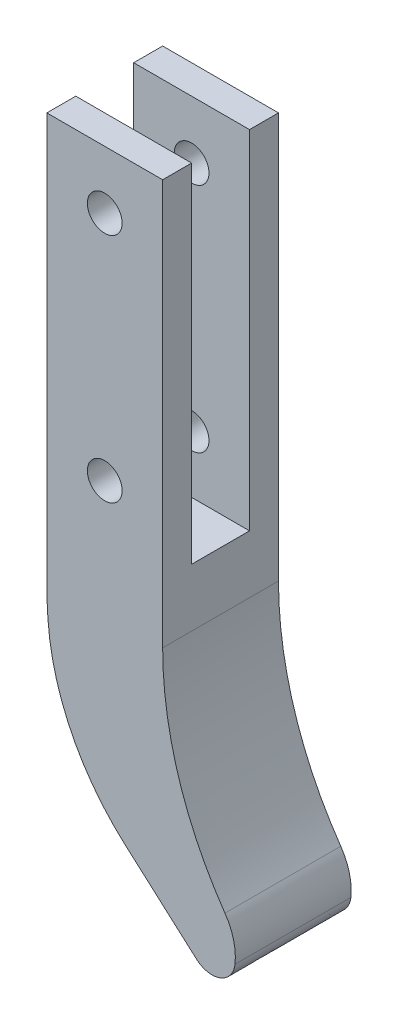
ISO-10303-21;
HEADER;
FILE_DESCRIPTION(('STEP AP214'),'2;1');
FILE_NAME('part.step','',(''),(''),'','','');
FILE_SCHEMA(('AUTOMOTIVE_DESIGN { 1 0 10303 214 1 1 1 1 }'));
ENDSEC;
DATA;
#1=APPLICATION_CONTEXT('core data for automotive mechanical design processes');
#2=APPLICATION_PROTOCOL_DEFINITION('international standard','automotive_design',2000,#1);
#3=PRODUCT_CONTEXT('',#1,'mechanical');
#4=PRODUCT('Part','Part','',(#3));
#5=PRODUCT_RELATED_PRODUCT_CATEGORY('part','',(#4));
#6=PRODUCT_DEFINITION_FORMATION('','',#4);
#7=PRODUCT_DEFINITION_CONTEXT('part definition',#1,'design');
#8=PRODUCT_DEFINITION('design','',#6,#7);
#9=PRODUCT_DEFINITION_SHAPE('','',#8);
#10=(LENGTH_UNIT() NAMED_UNIT(*) SI_UNIT(.MILLI.,.METRE.));
#11=(NAMED_UNIT(*) PLANE_ANGLE_UNIT() SI_UNIT($,.RADIAN.));
#12=(NAMED_UNIT(*) SI_UNIT($,.STERADIAN.) SOLID_ANGLE_UNIT());
#13=UNCERTAINTY_MEASURE_WITH_UNIT(LENGTH_MEASURE(1.E-05),#10,'distance_accuracy_value','');
#14=(GEOMETRIC_REPRESENTATION_CONTEXT(3) GLOBAL_UNCERTAINTY_ASSIGNED_CONTEXT((#13)) GLOBAL_UNIT_ASSIGNED_CONTEXT((#10,
#11,#12)) REPRESENTATION_CONTEXT('',''));
#15=CARTESIAN_POINT('',(0.,0.,0.));
#16=DIRECTION('',(0.,0.,1.));
#17=DIRECTION('',(1.,0.,0.));
#18=AXIS2_PLACEMENT_3D('',#15,#16,#17);
#19=CARTESIAN_POINT('',(20.0488604862741,-36.3971514248094,10.));
#20=DIRECTION('',(0.,0.,-1.));
#21=DIRECTION('',(-1.,0.,0.));
#22=AXIS2_PLACEMENT_3D('',#19,#20,#21);
#23=CYLINDRICAL_SURFACE('',#22,20.);
#24=DIRECTION('',(0.,0.,1.));
#25=VECTOR('',#24,1.);
#26=CARTESIAN_POINT('',(6.78118868781741,-51.3627414582306,10.));
#27=LINE('',#26,#25);
#28=CARTESIAN_POINT('',(6.78118868781742,-51.3627414582306,10.));
#29=VERTEX_POINT('',#28);
#30=CARTESIAN_POINT('',(6.78118868781742,-51.3627414582306,0.));
#31=VERTEX_POINT('',#30);
#32=EDGE_CURVE('E353',#29,#31,#27,.F.);
#33=ORIENTED_EDGE('',*,*,#32,.F.);
#34=CARTESIAN_POINT('',(20.0488604862741,-36.3971514248094,10.));
#35=DIRECTION('',(0.,0.,1.));
#36=DIRECTION('',(1.,0.,0.));
#37=AXIS2_PLACEMENT_3D('',#34,#35,#36);
#38=CIRCLE('',#37,20.);
#39=CARTESIAN_POINT('',(0.0977209725483014,-37.7943028496189,10.));
#40=VERTEX_POINT('',#39);
#41=EDGE_CURVE('E51',#40,#29,#38,.T.);
#42=ORIENTED_EDGE('',*,*,#41,.F.);
#43=DIRECTION('',(0.,0.,-1.));
#44=VECTOR('',#43,1.);
#45=CARTESIAN_POINT('',(0.0977209725482875,-37.7943028496189,10.));
#46=LINE('',#45,#44);
#47=CARTESIAN_POINT('',(0.0977209725483014,-37.7943028496189,0.));
#48=VERTEX_POINT('',#47);
#49=EDGE_CURVE('E351',#48,#40,#46,.F.);
#50=ORIENTED_EDGE('',*,*,#49,.F.);
#51=CARTESIAN_POINT('',(20.0488604862741,-36.3971514248094,0.));
#52=DIRECTION('',(0.,0.,1.));
#53=DIRECTION('',(1.,0.,0.));
#54=AXIS2_PLACEMENT_3D('',#51,#52,#53);
#55=CIRCLE('',#54,20.);
#56=EDGE_CURVE('E11',#31,#48,#55,.F.);
#57=ORIENTED_EDGE('',*,*,#56,.F.);
#58=EDGE_LOOP('',(#33,#42,#50,#57));
#59=FACE_BOUND('',#58,.T.);
#60=ADVANCED_FACE('F43',(#59),#23,.T.);
#61=CARTESIAN_POINT('',(40.,-35.,10.));
#62=DIRECTION('',(0.,0.,-1.));
#63=DIRECTION('',(-1.,0.,0.));
#64=AXIS2_PLACEMENT_3D('',#61,#62,#63);
#65=CYLINDRICAL_SURFACE('',#64,40.);
#66=CARTESIAN_POINT('',(40.,-35.,0.));
#67=DIRECTION('',(0.,0.,1.));
#68=DIRECTION('',(1.,0.,0.));
#69=AXIS2_PLACEMENT_3D('',#66,#67,#68);
#70=CIRCLE('',#69,40.);
#71=CARTESIAN_POINT('',(0.,-35.,0.));
#72=VERTEX_POINT('',#71);
#73=EDGE_CURVE('E182',#72,#48,#70,.T.);
#74=ORIENTED_EDGE('',*,*,#73,.T.);
#75=ORIENTED_EDGE('',*,*,#49,.T.);
#76=CARTESIAN_POINT('',(40.,-35.,10.));
#77=DIRECTION('',(0.,0.,1.));
#78=DIRECTION('',(1.,0.,0.));
#79=AXIS2_PLACEMENT_3D('',#76,#77,#78);
#80=CIRCLE('',#79,40.);
#81=CARTESIAN_POINT('',(0.,-35.,10.));
#82=VERTEX_POINT('',#81);
#83=EDGE_CURVE('E189',#82,#40,#80,.T.);
#84=ORIENTED_EDGE('',*,*,#83,.F.);
#85=DIRECTION('',(0.,0.,-1.));
#86=VECTOR('',#85,1.);
#87=CARTESIAN_POINT('',(0.,-35.,10.));
#88=LINE('',#87,#86);
#89=EDGE_CURVE('E350',#82,#72,#88,.T.);
#90=ORIENTED_EDGE('',*,*,#89,.T.);
#91=EDGE_LOOP('',(#74,#75,#84,#90));
#92=FACE_BOUND('',#91,.T.);
#93=ADVANCED_FACE('F275',(#92),#65,.T.);
#94=CARTESIAN_POINT('',(11.2771867673099,-55.,10.));
#95=DIRECTION('',(0.,0.,-1.));
#96=DIRECTION('',(-1.,0.,0.));
#97=AXIS2_PLACEMENT_3D('',#94,#95,#96);
#98=CYLINDRICAL_SURFACE('',#97,5.);
#99=CARTESIAN_POINT('',(11.2771867673099,-55.,10.));
#100=DIRECTION('',(0.,0.,1.));
#101=DIRECTION('',(1.,0.,0.));
#102=AXIS2_PLACEMENT_3D('',#99,#100,#101);
#103=CIRCLE('',#102,5.);
#104=CARTESIAN_POINT('',(16.2486101930785,-55.5338062585981,10.));
#105=VERTEX_POINT('',#104);
#106=CARTESIAN_POINT('',(15.3804458005513,-52.1428571428571,10.));
#107=VERTEX_POINT('',#106);
#108=EDGE_CURVE('E193',#105,#107,#103,.T.);
#109=ORIENTED_EDGE('',*,*,#108,.F.);
#110=CARTESIAN_POINT('',(16.2486101930785,-55.5338062585982,-0.5));
#111=CARTESIAN_POINT('',(16.2486101930785,-55.5338062585982,3.16666666666667));
#112=CARTESIAN_POINT('',(16.2486101930785,-55.5338062585982,6.83333333333333));
#113=CARTESIAN_POINT('',(16.2486101930785,-55.5338062585982,10.5));
#114=(BOUNDED_CURVE() B_SPLINE_CURVE(3,(#110,#111,#112,#113),.UNSPECIFIED.,.F.,
.F.) B_SPLINE_CURVE_WITH_KNOTS((4,4),(-0.0005,0.0105),
.UNSPECIFIED.) CURVE() GEOMETRIC_REPRESENTATION_ITEM() RATIONAL_B_SPLINE_CURVE((1.,1.,1.,1.)) REPRESENTATION_ITEM(''));
#115=CARTESIAN_POINT('',(16.2486101930785,-55.5338062585982,0.));
#116=VERTEX_POINT('',#115);
#117=EDGE_CURVE('E299',#105,#116,#114,.F.);
#118=ORIENTED_EDGE('',*,*,#117,.T.);
#119=CARTESIAN_POINT('',(11.2771867673099,-55.,0.));
#120=DIRECTION('',(0.,0.,1.));
#121=DIRECTION('',(1.,0.,0.));
#122=AXIS2_PLACEMENT_3D('',#119,#120,#121);
#123=CIRCLE('',#122,5.);
#124=CARTESIAN_POINT('',(15.3804458005513,-52.1428571428571,0.));
#125=VERTEX_POINT('',#124);
#126=EDGE_CURVE('E216',#116,#125,#123,.T.);
#127=ORIENTED_EDGE('',*,*,#126,.T.);
#128=DIRECTION('',(0.,0.,-1.));
#129=VECTOR('',#128,1.);
#130=CARTESIAN_POINT('',(15.3804458005513,-52.1428571428571,10.));
#131=LINE('',#130,#129);
#132=EDGE_CURVE('E368',#107,#125,#131,.T.);
#133=ORIENTED_EDGE('',*,*,#132,.F.);
#134=EDGE_LOOP('',(#109,#118,#127,#133));
#135=FACE_BOUND('',#134,.T.);
#136=ADVANCED_FACE('F230',(#135),#98,.T.);
#137=CARTESIAN_POINT('',(0.,0.,10.));
#138=DIRECTION('',(0.,0.,1.));
#139=DIRECTION('',(1.,0.,0.));
#140=AXIS2_PLACEMENT_3D('',#137,#138,#139);
#141=PLANE('',#140);
#142=CARTESIAN_POINT('',(5.,-25.,10.));
#143=DIRECTION('',(0.,0.,1.));
#144=DIRECTION('',(1.,0.,0.));
#145=AXIS2_PLACEMENT_3D('',#142,#143,#144);
#146=CIRCLE('',#145,1.5);
#147=CARTESIAN_POINT('',(6.5,-25.,10.));
#148=VERTEX_POINT('',#147);
#149=EDGE_CURVE('E312',#148,#148,#146,.T.);
#150=ORIENTED_EDGE('',*,*,#149,.F.);
#151=EDGE_LOOP('',(#150));
#152=FACE_BOUND('',#151,.T.);
#153=CARTESIAN_POINT('',(5.,-5.,10.));
#154=DIRECTION('',(0.,0.,1.));
#155=DIRECTION('',(1.,0.,0.));
#156=AXIS2_PLACEMENT_3D('',#153,#154,#155);
#157=CIRCLE('',#156,1.5);
#158=CARTESIAN_POINT('',(6.5,-5.,10.));
#159=VERTEX_POINT('',#158);
#160=EDGE_CURVE('E331',#159,#159,#157,.T.);
#161=ORIENTED_EDGE('',*,*,#160,.F.);
#162=EDGE_LOOP('',(#161));
#163=FACE_BOUND('',#162,.T.);
#164=ORIENTED_EDGE('',*,*,#83,.T.);
#165=ORIENTED_EDGE('',*,*,#41,.T.);
#166=DIRECTION('',(0.74827950167106,-0.663383589922837,0.));
#167=VECTOR('',#166,1.);
#168=CARTESIAN_POINT('',(-22.5120264657496,-25.392982583962,10.));
#169=LINE('',#168,#167);
#170=CARTESIAN_POINT('',(12.9332736429254,-56.816842758501,10.));
#171=VERTEX_POINT('',#170);
#172=EDGE_CURVE('E313',#29,#171,#169,.T.);
#173=ORIENTED_EDGE('',*,*,#172,.T.);
#174=CARTESIAN_POINT('',(16.2486101930785,-55.5338062585982,9.99999999999999));
#175=CARTESIAN_POINT('',(15.8346539242544,-59.3890474794122,9.99999999999999));
#176=CARTESIAN_POINT('',(12.9332736429254,-56.816842758501,9.99999999999999));
#177=(BOUNDED_CURVE() B_SPLINE_CURVE(2,(#174,#175,#176),.UNSPECIFIED.,.F.,
.F.) B_SPLINE_CURVE_WITH_KNOTS((3,3),(0.,1.),
.UNSPECIFIED.) CURVE() GEOMETRIC_REPRESENTATION_ITEM() RATIONAL_B_SPLINE_CURVE((1.,
0.45841853823333,1.)) REPRESENTATION_ITEM(''));
#178=EDGE_CURVE('E210',#171,#105,#177,.F.);
#179=ORIENTED_EDGE('',*,*,#178,.T.);
#180=ORIENTED_EDGE('',*,*,#108,.T.);
#181=CARTESIAN_POINT('',(40.,-35.,10.));
#182=DIRECTION('',(0.,0.,1.));
#183=DIRECTION('',(1.,0.,0.));
#184=AXIS2_PLACEMENT_3D('',#181,#182,#183);
#185=CIRCLE('',#184,30.);
#186=CARTESIAN_POINT('',(10.,-35.,10.));
#187=VERTEX_POINT('',#186);
#188=EDGE_CURVE('E197',#187,#107,#185,.T.);
#189=ORIENTED_EDGE('',*,*,#188,.F.);
#190=DIRECTION('',(0.,-1.,0.));
#191=VECTOR('',#190,1.);
#192=CARTESIAN_POINT('',(10.,0.,10.));
#193=LINE('',#192,#191);
#194=CARTESIAN_POINT('',(10.,0.,10.));
#195=VERTEX_POINT('',#194);
#196=EDGE_CURVE('E437',#195,#187,#193,.T.);
#197=ORIENTED_EDGE('',*,*,#196,.F.);
#198=DIRECTION('',(1.,0.,0.));
#199=VECTOR('',#198,1.);
#200=CARTESIAN_POINT('',(0.,0.,10.));
#201=LINE('',#200,#199);
#202=CARTESIAN_POINT('',(0.,0.,10.));
#203=VERTEX_POINT('',#202);
#204=EDGE_CURVE('E434',#203,#195,#201,.T.);
#205=ORIENTED_EDGE('',*,*,#204,.F.);
#206=DIRECTION('',(0.,-1.,0.));
#207=VECTOR('',#206,1.);
#208=CARTESIAN_POINT('',(0.,0.,10.));
#209=LINE('',#208,#207);
#210=EDGE_CURVE('E345',#203,#82,#209,.T.);
#211=ORIENTED_EDGE('',*,*,#210,.T.);
#212=EDGE_LOOP('',(#164,#165,#173,#179,#180,#189,#197,#205,#211));
#213=FACE_BOUND('',#212,.T.);
#214=ADVANCED_FACE('F219',(#152,#163,#213),#141,.T.);
#215=CARTESIAN_POINT('',(0.,0.,0.));
#216=DIRECTION('',(0.,0.,1.));
#217=DIRECTION('',(1.,0.,0.));
#218=AXIS2_PLACEMENT_3D('',#215,#216,#217);
#219=PLANE('',#218);
#220=CARTESIAN_POINT('',(5.,-5.,0.));
#221=DIRECTION('',(0.,0.,1.));
#222=DIRECTION('',(1.,0.,0.));
#223=AXIS2_PLACEMENT_3D('',#220,#221,#222);
#224=CIRCLE('',#223,1.5);
#225=CARTESIAN_POINT('',(6.5,-5.,0.));
#226=VERTEX_POINT('',#225);
#227=EDGE_CURVE('E332',#226,#226,#224,.T.);
#228=ORIENTED_EDGE('',*,*,#227,.T.);
#229=EDGE_LOOP('',(#228));
#230=FACE_BOUND('',#229,.T.);
#231=CARTESIAN_POINT('',(5.,-25.,0.));
#232=DIRECTION('',(0.,0.,1.));
#233=DIRECTION('',(1.,0.,0.));
#234=AXIS2_PLACEMENT_3D('',#231,#232,#233);
#235=CIRCLE('',#234,1.5);
#236=CARTESIAN_POINT('',(6.5,-25.,0.));
#237=VERTEX_POINT('',#236);
#238=EDGE_CURVE('E319',#237,#237,#235,.T.);
#239=ORIENTED_EDGE('',*,*,#238,.T.);
#240=EDGE_LOOP('',(#239));
#241=FACE_BOUND('',#240,.T.);
#242=DIRECTION('',(0.74827950167106,-0.663383589922837,0.));
#243=VECTOR('',#242,1.);
#244=CARTESIAN_POINT('',(-22.5120264657496,-25.392982583962,0.));
#245=LINE('',#244,#243);
#246=CARTESIAN_POINT('',(12.9332736429254,-56.816842758501,0.));
#247=VERTEX_POINT('',#246);
#248=EDGE_CURVE('E303',#31,#247,#245,.T.);
#249=ORIENTED_EDGE('',*,*,#248,.F.);
#250=ORIENTED_EDGE('',*,*,#56,.T.);
#251=ORIENTED_EDGE('',*,*,#73,.F.);
#252=DIRECTION('',(0.,-1.,0.));
#253=VECTOR('',#252,1.);
#254=CARTESIAN_POINT('',(0.,0.,0.));
#255=LINE('',#254,#253);
#256=CARTESIAN_POINT('',(0.,0.,0.));
#257=VERTEX_POINT('',#256);
#258=EDGE_CURVE('E194',#257,#72,#255,.T.);
#259=ORIENTED_EDGE('',*,*,#258,.F.);
#260=DIRECTION('',(1.,0.,0.));
#261=VECTOR('',#260,1.);
#262=CARTESIAN_POINT('',(0.,0.,0.));
#263=LINE('',#262,#261);
#264=CARTESIAN_POINT('',(10.,0.,0.));
#265=VERTEX_POINT('',#264);
#266=EDGE_CURVE('E421',#257,#265,#263,.T.);
#267=ORIENTED_EDGE('',*,*,#266,.T.);
#268=DIRECTION('',(0.,-1.,0.));
#269=VECTOR('',#268,1.);
#270=CARTESIAN_POINT('',(10.,0.,0.));
#271=LINE('',#270,#269);
#272=CARTESIAN_POINT('',(10.,-35.,0.));
#273=VERTEX_POINT('',#272);
#274=EDGE_CURVE('E409',#265,#273,#271,.T.);
#275=ORIENTED_EDGE('',*,*,#274,.T.);
#276=CARTESIAN_POINT('',(40.,-35.,0.));
#277=DIRECTION('',(0.,0.,1.));
#278=DIRECTION('',(1.,0.,0.));
#279=AXIS2_PLACEMENT_3D('',#276,#277,#278);
#280=CIRCLE('',#279,30.);
#281=EDGE_CURVE('E426',#273,#125,#280,.T.);
#282=ORIENTED_EDGE('',*,*,#281,.T.);
#283=ORIENTED_EDGE('',*,*,#126,.F.);
#284=CARTESIAN_POINT('',(12.9332736429254,-56.816842758501,0.));
#285=CARTESIAN_POINT('',(15.8346539242544,-59.3890474794122,0.));
#286=CARTESIAN_POINT('',(16.2486101930785,-55.5338062585981,0.));
#287=(BOUNDED_CURVE() B_SPLINE_CURVE(2,(#284,#285,#286),.UNSPECIFIED.,.F.,
.F.) B_SPLINE_CURVE_WITH_KNOTS((3,3),(0.,1.),
.UNSPECIFIED.) CURVE() GEOMETRIC_REPRESENTATION_ITEM() RATIONAL_B_SPLINE_CURVE((1.,
0.45841853823333,1.)) REPRESENTATION_ITEM(''));
#288=EDGE_CURVE('E358',#116,#247,#287,.F.);
#289=ORIENTED_EDGE('',*,*,#288,.T.);
#290=EDGE_LOOP('',(#249,#250,#251,#259,#267,#275,#282,#283,#289));
#291=FACE_BOUND('',#290,.T.);
#292=ADVANCED_FACE('F229',(#230,#241,#291),#219,.F.);
#293=CARTESIAN_POINT('',(0.,0.,10.));
#294=DIRECTION('',(0.,1.,0.));
#295=DIRECTION('',(0.,0.,1.));
#296=AXIS2_PLACEMENT_3D('',#293,#294,#295);
#297=PLANE('',#296);
#298=DIRECTION('',(0.,0.,-1.));
#299=VECTOR('',#298,1.);
#300=CARTESIAN_POINT('',(0.,0.,10.));
#301=LINE('',#300,#299);
#302=CARTESIAN_POINT('',(0.,0.,2.5));
#303=VERTEX_POINT('',#302);
#304=EDGE_CURVE('E406',#303,#257,#301,.T.);
#305=ORIENTED_EDGE('',*,*,#304,.F.);
#306=DIRECTION('',(1.,0.,0.));
#307=VECTOR('',#306,1.);
#308=CARTESIAN_POINT('',(0.,0.,2.5));
#309=LINE('',#308,#307);
#310=CARTESIAN_POINT('',(10.,0.,2.5));
#311=VERTEX_POINT('',#310);
#312=EDGE_CURVE('E183',#303,#311,#309,.T.);
#313=ORIENTED_EDGE('',*,*,#312,.T.);
#314=DIRECTION('',(0.,0.,-1.));
#315=VECTOR('',#314,1.);
#316=CARTESIAN_POINT('',(10.,0.,10.));
#317=LINE('',#316,#315);
#318=EDGE_CURVE('E404',#311,#265,#317,.T.);
#319=ORIENTED_EDGE('',*,*,#318,.T.);
#320=ORIENTED_EDGE('',*,*,#266,.F.);
#321=EDGE_LOOP('',(#305,#313,#319,#320));
#322=FACE_BOUND('',#321,.T.);
#323=ADVANCED_FACE('F236',(#322),#297,.T.);
#324=CARTESIAN_POINT('',(40.,-35.,10.));
#325=DIRECTION('',(0.,0.,-1.));
#326=DIRECTION('',(-1.,0.,0.));
#327=AXIS2_PLACEMENT_3D('',#324,#325,#326);
#328=CYLINDRICAL_SURFACE('',#327,30.);
#329=ORIENTED_EDGE('',*,*,#281,.F.);
#330=DIRECTION('',(0.,0.,-1.));
#331=VECTOR('',#330,1.);
#332=CARTESIAN_POINT('',(10.,-35.,10.));
#333=LINE('',#332,#331);
#334=EDGE_CURVE('E371',#187,#273,#333,.T.);
#335=ORIENTED_EDGE('',*,*,#334,.F.);
#336=ORIENTED_EDGE('',*,*,#188,.T.);
#337=ORIENTED_EDGE('',*,*,#132,.T.);
#338=EDGE_LOOP('',(#329,#335,#336,#337));
#339=FACE_BOUND('',#338,.T.);
#340=ADVANCED_FACE('F443',(#339),#328,.F.);
#341=CARTESIAN_POINT('',(10.,0.,10.));
#342=DIRECTION('',(1.,0.,0.));
#343=DIRECTION('',(0.,1.,0.));
#344=AXIS2_PLACEMENT_3D('',#341,#342,#343);
#345=PLANE('',#344);
#346=DIRECTION('',(0.,-1.,0.));
#347=VECTOR('',#346,1.);
#348=CARTESIAN_POINT('',(10.,0.,7.5));
#349=LINE('',#348,#347);
#350=CARTESIAN_POINT('',(10.,0.,7.5));
#351=VERTEX_POINT('',#350);
#352=CARTESIAN_POINT('',(10.,-30.,7.5));
#353=VERTEX_POINT('',#352);
#354=EDGE_CURVE('E142',#351,#353,#349,.T.);
#355=ORIENTED_EDGE('',*,*,#354,.F.);
#356=EDGE_CURVE('E379',#195,#351,#317,.T.);
#357=ORIENTED_EDGE('',*,*,#356,.F.);
#358=ORIENTED_EDGE('',*,*,#196,.T.);
#359=ORIENTED_EDGE('',*,*,#334,.T.);
#360=ORIENTED_EDGE('',*,*,#274,.F.);
#361=ORIENTED_EDGE('',*,*,#318,.F.);
#362=DIRECTION('',(0.,-1.,0.));
#363=VECTOR('',#362,1.);
#364=CARTESIAN_POINT('',(10.,0.,2.5));
#365=LINE('',#364,#363);
#366=CARTESIAN_POINT('',(10.,-30.,2.5));
#367=VERTEX_POINT('',#366);
#368=EDGE_CURVE('E163',#311,#367,#365,.T.);
#369=ORIENTED_EDGE('',*,*,#368,.T.);
#370=DIRECTION('',(0.,0.,-1.));
#371=VECTOR('',#370,1.);
#372=CARTESIAN_POINT('',(10.,-30.,0.));
#373=LINE('',#372,#371);
#374=EDGE_CURVE('E167',#353,#367,#373,.T.);
#375=ORIENTED_EDGE('',*,*,#374,.F.);
#376=EDGE_LOOP('',(#355,#357,#358,#359,#360,#361,#369,#375));
#377=FACE_BOUND('',#376,.T.);
#378=ADVANCED_FACE('F407',(#377),#345,.T.);
#379=DIRECTION('',(1.,0.,0.));
#380=VECTOR('',#379,1.);
#381=CARTESIAN_POINT('',(0.,0.,7.5));
#382=LINE('',#381,#380);
#383=CARTESIAN_POINT('',(0.,0.,7.5));
#384=VERTEX_POINT('',#383);
#385=EDGE_CURVE('E179',#384,#351,#382,.T.);
#386=ORIENTED_EDGE('',*,*,#385,.F.);
#387=EDGE_CURVE('E161',#203,#384,#301,.T.);
#388=ORIENTED_EDGE('',*,*,#387,.F.);
#389=ORIENTED_EDGE('',*,*,#204,.T.);
#390=ORIENTED_EDGE('',*,*,#356,.T.);
#391=EDGE_LOOP('',(#386,#388,#389,#390));
#392=FACE_BOUND('',#391,.T.);
#393=ADVANCED_FACE('F448',(#392),#297,.T.);
#394=CARTESIAN_POINT('',(0.,0.,10.));
#395=DIRECTION('',(1.,0.,0.));
#396=DIRECTION('',(0.,1.,0.));
#397=AXIS2_PLACEMENT_3D('',#394,#395,#396);
#398=PLANE('',#397);
#399=ORIENTED_EDGE('',*,*,#387,.T.);
#400=DIRECTION('',(0.,-1.,0.));
#401=VECTOR('',#400,1.);
#402=CARTESIAN_POINT('',(0.,0.,7.5));
#403=LINE('',#402,#401);
#404=CARTESIAN_POINT('',(0.,-30.,7.5));
#405=VERTEX_POINT('',#404);
#406=EDGE_CURVE('E139',#384,#405,#403,.T.);
#407=ORIENTED_EDGE('',*,*,#406,.T.);
#408=DIRECTION('',(0.,0.,-1.));
#409=VECTOR('',#408,1.);
#410=CARTESIAN_POINT('',(0.,-30.,0.));
#411=LINE('',#410,#409);
#412=CARTESIAN_POINT('',(0.,-30.,2.5));
#413=VERTEX_POINT('',#412);
#414=EDGE_CURVE('E151',#405,#413,#411,.T.);
#415=ORIENTED_EDGE('',*,*,#414,.T.);
#416=DIRECTION('',(0.,-1.,0.));
#417=VECTOR('',#416,1.);
#418=CARTESIAN_POINT('',(0.,0.,2.5));
#419=LINE('',#418,#417);
#420=EDGE_CURVE('E148',#303,#413,#419,.T.);
#421=ORIENTED_EDGE('',*,*,#420,.F.);
#422=ORIENTED_EDGE('',*,*,#304,.T.);
#423=ORIENTED_EDGE('',*,*,#258,.T.);
#424=ORIENTED_EDGE('',*,*,#89,.F.);
#425=ORIENTED_EDGE('',*,*,#210,.F.);
#426=EDGE_LOOP('',(#399,#407,#415,#421,#422,#423,#424,#425));
#427=FACE_BOUND('',#426,.T.);
#428=ADVANCED_FACE('F159',(#427),#398,.F.);
#429=CARTESIAN_POINT('',(0.,0.,7.5));
#430=DIRECTION('',(0.,0.,1.));
#431=DIRECTION('',(1.,0.,0.));
#432=AXIS2_PLACEMENT_3D('',#429,#430,#431);
#433=PLANE('',#432);
#434=CARTESIAN_POINT('',(5.,-25.,7.5));
#435=DIRECTION('',(0.,0.,1.));
#436=DIRECTION('',(1.,0.,0.));
#437=AXIS2_PLACEMENT_3D('',#434,#435,#436);
#438=CIRCLE('',#437,1.5);
#439=CARTESIAN_POINT('',(6.5,-25.,7.5));
#440=VERTEX_POINT('',#439);
#441=EDGE_CURVE('E327',#440,#440,#438,.T.);
#442=ORIENTED_EDGE('',*,*,#441,.T.);
#443=EDGE_LOOP('',(#442));
#444=FACE_BOUND('',#443,.T.);
#445=CARTESIAN_POINT('',(5.,-5.,7.5));
#446=DIRECTION('',(0.,0.,1.));
#447=DIRECTION('',(1.,0.,0.));
#448=AXIS2_PLACEMENT_3D('',#445,#446,#447);
#449=CIRCLE('',#448,1.5);
#450=CARTESIAN_POINT('',(6.5,-5.,7.5));
#451=VERTEX_POINT('',#450);
#452=EDGE_CURVE('E170',#451,#451,#449,.T.);
#453=ORIENTED_EDGE('',*,*,#452,.T.);
#454=EDGE_LOOP('',(#453));
#455=FACE_BOUND('',#454,.T.);
#456=ORIENTED_EDGE('',*,*,#354,.T.);
#457=DIRECTION('',(1.,0.,0.));
#458=VECTOR('',#457,1.);
#459=CARTESIAN_POINT('',(0.,-30.,7.5));
#460=LINE('',#459,#458);
#461=EDGE_CURVE('E135',#405,#353,#460,.T.);
#462=ORIENTED_EDGE('',*,*,#461,.F.);
#463=ORIENTED_EDGE('',*,*,#406,.F.);
#464=ORIENTED_EDGE('',*,*,#385,.T.);
#465=EDGE_LOOP('',(#456,#462,#463,#464));
#466=FACE_BOUND('',#465,.T.);
#467=ADVANCED_FACE('F137',(#444,#455,#466),#433,.F.);
#468=CARTESIAN_POINT('',(0.,0.,2.5));
#469=DIRECTION('',(0.,0.,1.));
#470=DIRECTION('',(0.,-1.,0.));
#471=AXIS2_PLACEMENT_3D('',#468,#469,#470);
#472=PLANE('',#471);
#473=CARTESIAN_POINT('',(5.,-25.,2.5));
#474=DIRECTION('',(0.,0.,1.));
#475=DIRECTION('',(0.,-1.,0.));
#476=AXIS2_PLACEMENT_3D('',#473,#474,#475);
#477=CIRCLE('',#476,1.5);
#478=CARTESIAN_POINT('',(5.,-26.5,2.5));
#479=VERTEX_POINT('',#478);
#480=EDGE_CURVE('E323',#479,#479,#477,.T.);
#481=ORIENTED_EDGE('',*,*,#480,.F.);
#482=EDGE_LOOP('',(#481));
#483=FACE_BOUND('',#482,.T.);
#484=CARTESIAN_POINT('',(5.,-5.,2.5));
#485=DIRECTION('',(0.,0.,1.));
#486=DIRECTION('',(0.,-1.,0.));
#487=AXIS2_PLACEMENT_3D('',#484,#485,#486);
#488=CIRCLE('',#487,1.5);
#489=CARTESIAN_POINT('',(5.,-6.5,2.5));
#490=VERTEX_POINT('',#489);
#491=EDGE_CURVE('E335',#490,#490,#488,.T.);
#492=ORIENTED_EDGE('',*,*,#491,.F.);
#493=EDGE_LOOP('',(#492));
#494=FACE_BOUND('',#493,.T.);
#495=ORIENTED_EDGE('',*,*,#368,.F.);
#496=ORIENTED_EDGE('',*,*,#312,.F.);
#497=ORIENTED_EDGE('',*,*,#420,.T.);
#498=DIRECTION('',(1.,0.,0.));
#499=VECTOR('',#498,1.);
#500=CARTESIAN_POINT('',(0.,-30.,2.5));
#501=LINE('',#500,#499);
#502=EDGE_CURVE('E147',#413,#367,#501,.T.);
#503=ORIENTED_EDGE('',*,*,#502,.T.);
#504=EDGE_LOOP('',(#495,#496,#497,#503));
#505=FACE_BOUND('',#504,.T.);
#506=ADVANCED_FACE('F393',(#483,#494,#505),#472,.T.);
#507=CARTESIAN_POINT('',(0.,-30.,0.));
#508=DIRECTION('',(0.,-1.,0.));
#509=DIRECTION('',(1.,0.,0.));
#510=AXIS2_PLACEMENT_3D('',#507,#508,#509);
#511=PLANE('',#510);
#512=ORIENTED_EDGE('',*,*,#374,.T.);
#513=ORIENTED_EDGE('',*,*,#502,.F.);
#514=ORIENTED_EDGE('',*,*,#414,.F.);
#515=ORIENTED_EDGE('',*,*,#461,.T.);
#516=EDGE_LOOP('',(#512,#513,#514,#515));
#517=FACE_BOUND('',#516,.T.);
#518=ADVANCED_FACE('F152',(#517),#511,.F.);
#519=CARTESIAN_POINT('',(5.,-5.,0.));
#520=DIRECTION('',(0.,0.,1.));
#521=DIRECTION('',(1.,0.,0.));
#522=AXIS2_PLACEMENT_3D('',#519,#520,#521);
#523=CYLINDRICAL_SURFACE('',#522,1.5);
#524=ORIENTED_EDGE('',*,*,#491,.T.);
#525=EDGE_LOOP('',(#524));
#526=FACE_BOUND('',#525,.T.);
#527=ORIENTED_EDGE('',*,*,#227,.F.);
#528=EDGE_LOOP('',(#527));
#529=FACE_BOUND('',#528,.T.);
#530=ADVANCED_FACE('F471',(#526,#529),#523,.F.);
#531=ORIENTED_EDGE('',*,*,#160,.T.);
#532=EDGE_LOOP('',(#531));
#533=FACE_BOUND('',#532,.T.);
#534=ORIENTED_EDGE('',*,*,#452,.F.);
#535=EDGE_LOOP('',(#534));
#536=FACE_BOUND('',#535,.T.);
#537=ADVANCED_FACE('F340',(#533,#536),#523,.F.);
#538=CARTESIAN_POINT('',(5.,-25.,0.));
#539=DIRECTION('',(0.,0.,1.));
#540=DIRECTION('',(1.,0.,0.));
#541=AXIS2_PLACEMENT_3D('',#538,#539,#540);
#542=CYLINDRICAL_SURFACE('',#541,1.5);
#543=ORIENTED_EDGE('',*,*,#480,.T.);
#544=EDGE_LOOP('',(#543));
#545=FACE_BOUND('',#544,.T.);
#546=ORIENTED_EDGE('',*,*,#238,.F.);
#547=EDGE_LOOP('',(#546));
#548=FACE_BOUND('',#547,.T.);
#549=ADVANCED_FACE('F390',(#545,#548),#542,.F.);
#550=ORIENTED_EDGE('',*,*,#149,.T.);
#551=EDGE_LOOP('',(#550));
#552=FACE_BOUND('',#551,.T.);
#553=ORIENTED_EDGE('',*,*,#441,.F.);
#554=EDGE_LOOP('',(#553));
#555=FACE_BOUND('',#554,.T.);
#556=ADVANCED_FACE('F462',(#552,#555),#542,.F.);
#557=CARTESIAN_POINT('',(-22.5120264657496,-25.392982583962,0.));
#558=DIRECTION('',(-0.663383589922837,-0.74827950167106,0.));
#559=DIRECTION('',(0.74827950167106,-0.663383589922837,0.));
#560=AXIS2_PLACEMENT_3D('',#557,#558,#559);
#561=PLANE('',#560);
#562=ORIENTED_EDGE('',*,*,#172,.F.);
#563=ORIENTED_EDGE('',*,*,#32,.T.);
#564=ORIENTED_EDGE('',*,*,#248,.T.);
#565=CARTESIAN_POINT('',(12.9332736429254,-56.816842758501,10.5));
#566=CARTESIAN_POINT('',(12.9332736429254,-56.816842758501,6.83333333333334));
#567=CARTESIAN_POINT('',(12.9332736429254,-56.816842758501,3.16666666666666));
#568=CARTESIAN_POINT('',(12.9332736429254,-56.816842758501,-0.5));
#569=(BOUNDED_CURVE() B_SPLINE_CURVE(3,(#565,#566,#567,#568),.UNSPECIFIED.,.F.,
.F.) B_SPLINE_CURVE_WITH_KNOTS((4,4),(-0.0005,0.0105),
.UNSPECIFIED.) CURVE() GEOMETRIC_REPRESENTATION_ITEM() RATIONAL_B_SPLINE_CURVE((1.,1.,1.,1.)) REPRESENTATION_ITEM(''));
#570=EDGE_CURVE('E366',#247,#171,#569,.F.);
#571=ORIENTED_EDGE('',*,*,#570,.T.);
#572=EDGE_LOOP('',(#562,#563,#564,#571));
#573=FACE_BOUND('',#572,.T.);
#574=ADVANCED_FACE('F274',(#573),#561,.T.);
#575=CARTESIAN_POINT('',(12.9332736429254,-56.816842758501,-0.5));
#576=CARTESIAN_POINT('',(12.9332736429254,-56.816842758501,3.16666666666666));
#577=CARTESIAN_POINT('',(12.9332736429254,-56.816842758501,6.83333333333334));
#578=CARTESIAN_POINT('',(12.9332736429254,-56.816842758501,10.5));
#579=CARTESIAN_POINT('',(15.8346539242544,-59.3890474794122,-0.500000000000001));
#580=CARTESIAN_POINT('',(15.8346539242544,-59.3890474794122,3.16666666666666));
#581=CARTESIAN_POINT('',(15.8346539242544,-59.3890474794122,6.83333333333334));
#582=CARTESIAN_POINT('',(15.8346539242544,-59.3890474794122,10.5));
#583=CARTESIAN_POINT('',(16.2486101930785,-55.5338062585982,-0.5));
#584=CARTESIAN_POINT('',(16.2486101930785,-55.5338062585982,3.16666666666667));
#585=CARTESIAN_POINT('',(16.2486101930785,-55.5338062585982,6.83333333333333));
#586=CARTESIAN_POINT('',(16.2486101930785,-55.5338062585982,10.5));
#587=(BOUNDED_SURFACE() B_SPLINE_SURFACE(2,3,((#575,#576,#577,#578),(#579,#580,#581,#582),(#583,
#584,#585,#586)),.UNSPECIFIED.,.F.,.F.,.F.) B_SPLINE_SURFACE_WITH_KNOTS((3,3),(4,4),(0.,1.),
(-0.0005,0.0105),.UNSPECIFIED.) GEOMETRIC_REPRESENTATION_ITEM() RATIONAL_B_SPLINE_SURFACE(((1.,
1.,1.,1.),(0.45841853823333,0.45841853823333,0.45841853823333,0.45841853823333),(1.,1.,1.,1.))) REPRESENTATION_ITEM('') SURFACE());
#588=ORIENTED_EDGE('',*,*,#288,.F.);
#589=ORIENTED_EDGE('',*,*,#117,.F.);
#590=ORIENTED_EDGE('',*,*,#178,.F.);
#591=ORIENTED_EDGE('',*,*,#570,.F.);
#592=EDGE_LOOP('',(#588,#589,#590,#591));
#593=FACE_BOUND('',#592,.T.);
#594=ADVANCED_FACE('F261',(#593),#587,.T.);
#595=CLOSED_SHELL('',(#60,#93,#136,#214,#292,#323,#340,#378,#393,#428,#467,#506,#518,#530,#537,
#549,#556,#574,#594));
#596=MANIFOLD_SOLID_BREP('B2',#595);
#597=ADVANCED_BREP_SHAPE_REPRESENTATION('',(#18,#596),#14);
#598=SHAPE_DEFINITION_REPRESENTATION(#9,#597);
ENDSEC;
END-ISO-10303-21;
